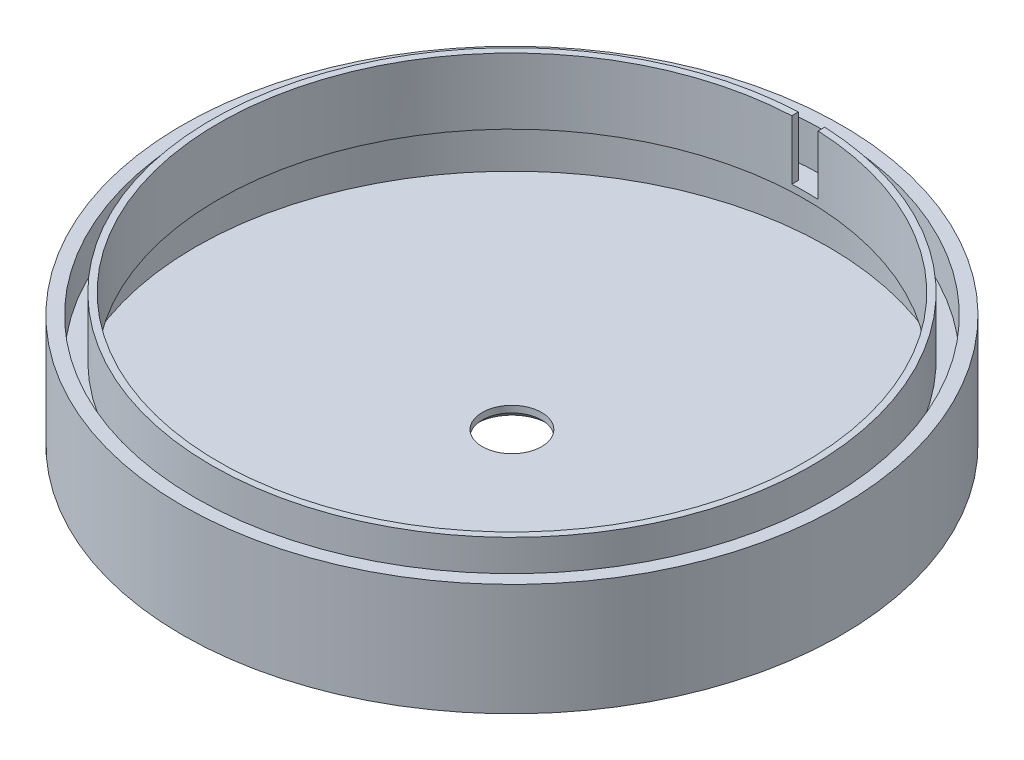
ISO-10303-21;
HEADER;
FILE_DESCRIPTION(('STEP AP214'),'2;1');
FILE_NAME('part.step','',(''),(''),'','','');
FILE_SCHEMA(('AUTOMOTIVE_DESIGN { 1 0 10303 214 1 1 1 1 }'));
ENDSEC;
DATA;
#1=APPLICATION_CONTEXT('core data for automotive mechanical design processes');
#2=APPLICATION_PROTOCOL_DEFINITION('international standard','automotive_design',2000,#1);
#3=PRODUCT_CONTEXT('',#1,'mechanical');
#4=PRODUCT('Part','Part','',(#3));
#5=PRODUCT_RELATED_PRODUCT_CATEGORY('part','',(#4));
#6=PRODUCT_DEFINITION_FORMATION('','',#4);
#7=PRODUCT_DEFINITION_CONTEXT('part definition',#1,'design');
#8=PRODUCT_DEFINITION('design','',#6,#7);
#9=PRODUCT_DEFINITION_SHAPE('','',#8);
#10=(LENGTH_UNIT() NAMED_UNIT(*) SI_UNIT(.MILLI.,.METRE.));
#11=(NAMED_UNIT(*) PLANE_ANGLE_UNIT() SI_UNIT($,.RADIAN.));
#12=(NAMED_UNIT(*) SI_UNIT($,.STERADIAN.) SOLID_ANGLE_UNIT());
#13=UNCERTAINTY_MEASURE_WITH_UNIT(LENGTH_MEASURE(1.E-05),#10,'distance_accuracy_value','');
#14=(GEOMETRIC_REPRESENTATION_CONTEXT(3) GLOBAL_UNCERTAINTY_ASSIGNED_CONTEXT((#13)) GLOBAL_UNIT_ASSIGNED_CONTEXT((#10,
#11,#12)) REPRESENTATION_CONTEXT('',''));
#15=CARTESIAN_POINT('',(0.,0.,0.));
#16=DIRECTION('',(0.,0.,1.));
#17=DIRECTION('',(1.,0.,0.));
#18=AXIS2_PLACEMENT_3D('',#15,#16,#17);
#19=CARTESIAN_POINT('',(0.,11.,0.));
#20=DIRECTION('',(0.,1.,0.));
#21=DIRECTION('',(0.,0.,1.));
#22=AXIS2_PLACEMENT_3D('',#19,#20,#21);
#23=PLANE('',#22);
#24=CARTESIAN_POINT('',(0.,11.,0.));
#25=DIRECTION('',(0.,1.,0.));
#26=DIRECTION('',(0.,0.,1.));
#27=AXIS2_PLACEMENT_3D('',#24,#25,#26);
#28=CIRCLE('',#27,45.5);
#29=CARTESIAN_POINT('',(1.99999999999999,11.,-45.4560227032678));
#30=VERTEX_POINT('',#29);
#31=CARTESIAN_POINT('',(-2.00000000000001,11.,-45.4560227032678));
#32=VERTEX_POINT('',#31);
#33=EDGE_CURVE('E90',#30,#32,#28,.F.);
#34=ORIENTED_EDGE('',*,*,#33,.T.);
#35=DIRECTION('',(0.,0.,-1.));
#36=VECTOR('',#35,1.);
#37=CARTESIAN_POINT('',(-2.00000000000001,11.,-46.5));
#38=LINE('',#37,#36);
#39=CARTESIAN_POINT('',(-2.00000000000001,11.,-44.4550334607905));
#40=VERTEX_POINT('',#39);
#41=EDGE_CURVE('E77',#40,#32,#38,.T.);
#42=ORIENTED_EDGE('',*,*,#41,.F.);
#43=CARTESIAN_POINT('',(0.,11.,0.));
#44=DIRECTION('',(0.,1.,0.));
#45=DIRECTION('',(0.,0.,1.));
#46=AXIS2_PLACEMENT_3D('',#43,#44,#45);
#47=CIRCLE('',#46,44.5);
#48=CARTESIAN_POINT('',(1.99999999999999,11.,-44.4550334607905));
#49=VERTEX_POINT('',#48);
#50=EDGE_CURVE('E88',#49,#40,#47,.T.);
#51=ORIENTED_EDGE('',*,*,#50,.F.);
#52=DIRECTION('',(0.,0.,1.));
#53=VECTOR('',#52,1.);
#54=CARTESIAN_POINT('',(1.99999999999999,11.,-46.5));
#55=LINE('',#54,#53);
#56=EDGE_CURVE('E48',#30,#49,#55,.T.);
#57=ORIENTED_EDGE('',*,*,#56,.F.);
#58=EDGE_LOOP('',(#34,#42,#51,#57));
#59=FACE_BOUND('',#58,.T.);
#60=CARTESIAN_POINT('',(0.,11.,0.));
#61=DIRECTION('',(0.,1.,0.));
#62=DIRECTION('',(0.,0.,1.));
#63=AXIS2_PLACEMENT_3D('',#60,#61,#62);
#64=CIRCLE('',#63,48.);
#65=CARTESIAN_POINT('',(0.,11.,48.));
#66=VERTEX_POINT('',#65);
#67=EDGE_CURVE('E130',#66,#66,#64,.T.);
#68=ORIENTED_EDGE('',*,*,#67,.T.);
#69=EDGE_LOOP('',(#68));
#70=FACE_BOUND('',#69,.T.);
#71=ADVANCED_FACE('F33',(#59,#70),#23,.T.);
#72=CARTESIAN_POINT('',(0.,17.,0.));
#73=DIRECTION('',(0.,-1.,0.));
#74=DIRECTION('',(0.,0.,-1.));
#75=AXIS2_PLACEMENT_3D('',#72,#73,#74);
#76=CYLINDRICAL_SURFACE('',#75,48.);
#77=CARTESIAN_POINT('',(0.,2.,0.));
#78=DIRECTION('',(0.,1.,0.));
#79=DIRECTION('',(0.,0.,1.));
#80=AXIS2_PLACEMENT_3D('',#77,#78,#79);
#81=CIRCLE('',#80,48.);
#82=CARTESIAN_POINT('',(0.,2.,48.));
#83=VERTEX_POINT('',#82);
#84=EDGE_CURVE('E109',#83,#83,#81,.T.);
#85=ORIENTED_EDGE('',*,*,#84,.F.);
#86=EDGE_LOOP('',(#85));
#87=FACE_BOUND('',#86,.T.);
#88=CARTESIAN_POINT('',(0.,10.,0.));
#89=DIRECTION('',(0.,1.,0.));
#90=DIRECTION('',(0.,0.,1.));
#91=AXIS2_PLACEMENT_3D('',#88,#89,#90);
#92=CIRCLE('',#91,48.);
#93=CARTESIAN_POINT('',(0.,10.,48.));
#94=VERTEX_POINT('',#93);
#95=EDGE_CURVE('E108',#94,#94,#92,.T.);
#96=ORIENTED_EDGE('',*,*,#95,.T.);
#97=EDGE_LOOP('',(#96));
#98=FACE_BOUND('',#97,.T.);
#99=ADVANCED_FACE('F148',(#87,#98),#76,.F.);
#100=CARTESIAN_POINT('',(0.,0.,0.));
#101=DIRECTION('',(0.,1.,0.));
#102=DIRECTION('',(0.,0.,1.));
#103=AXIS2_PLACEMENT_3D('',#100,#101,#102);
#104=PLANE('',#103);
#105=CARTESIAN_POINT('',(0.,0.,0.));
#106=DIRECTION('',(0.,1.,0.));
#107=DIRECTION('',(0.,0.,1.));
#108=AXIS2_PLACEMENT_3D('',#105,#106,#107);
#109=CIRCLE('',#108,5.50000000000001);
#110=CARTESIAN_POINT('',(0.,0.,5.50000000000001));
#111=VERTEX_POINT('',#110);
#112=EDGE_CURVE('E120',#111,#111,#109,.T.);
#113=ORIENTED_EDGE('',*,*,#112,.T.);
#114=EDGE_LOOP('',(#113));
#115=FACE_BOUND('',#114,.T.);
#116=CARTESIAN_POINT('',(0.,0.,0.));
#117=DIRECTION('',(0.,1.,0.));
#118=DIRECTION('',(0.,0.,1.));
#119=AXIS2_PLACEMENT_3D('',#116,#117,#118);
#120=CIRCLE('',#119,50.);
#121=CARTESIAN_POINT('',(0.,0.,50.));
#122=VERTEX_POINT('',#121);
#123=EDGE_CURVE('E116',#122,#122,#120,.T.);
#124=ORIENTED_EDGE('',*,*,#123,.F.);
#125=EDGE_LOOP('',(#124));
#126=FACE_BOUND('',#125,.T.);
#127=ADVANCED_FACE('F153',(#115,#126),#104,.F.);
#128=CARTESIAN_POINT('',(0.,2.,0.));
#129=DIRECTION('',(0.,1.,0.));
#130=DIRECTION('',(0.,0.,1.));
#131=AXIS2_PLACEMENT_3D('',#128,#129,#130);
#132=PLANE('',#131);
#133=ORIENTED_EDGE('',*,*,#84,.T.);
#134=EDGE_LOOP('',(#133));
#135=FACE_BOUND('',#134,.T.);
#136=CARTESIAN_POINT('',(0.,2.,0.));
#137=DIRECTION('',(0.,1.,0.));
#138=DIRECTION('',(0.,0.,1.));
#139=AXIS2_PLACEMENT_3D('',#136,#137,#138);
#140=CIRCLE('',#139,4.5);
#141=CARTESIAN_POINT('',(0.,2.,4.5));
#142=VERTEX_POINT('',#141);
#143=EDGE_CURVE('E113',#142,#142,#140,.F.);
#144=ORIENTED_EDGE('',*,*,#143,.T.);
#145=EDGE_LOOP('',(#144));
#146=FACE_BOUND('',#145,.T.);
#147=ADVANCED_FACE('F171',(#135,#146),#132,.T.);
#148=CARTESIAN_POINT('',(0.,17.,0.));
#149=DIRECTION('',(0.,-1.,0.));
#150=DIRECTION('',(0.,0.,-1.));
#151=AXIS2_PLACEMENT_3D('',#148,#149,#150);
#152=CYLINDRICAL_SURFACE('',#151,50.);
#153=CARTESIAN_POINT('',(0.,17.,0.));
#154=DIRECTION('',(0.,1.,0.));
#155=DIRECTION('',(0.,0.,1.));
#156=AXIS2_PLACEMENT_3D('',#153,#154,#155);
#157=CIRCLE('',#156,50.);
#158=CARTESIAN_POINT('',(0.,17.,50.));
#159=VERTEX_POINT('',#158);
#160=EDGE_CURVE('E117',#159,#159,#157,.T.);
#161=ORIENTED_EDGE('',*,*,#160,.F.);
#162=EDGE_LOOP('',(#161));
#163=FACE_BOUND('',#162,.T.);
#164=ORIENTED_EDGE('',*,*,#123,.T.);
#165=EDGE_LOOP('',(#164));
#166=FACE_BOUND('',#165,.T.);
#167=ADVANCED_FACE('F174',(#163,#166),#152,.T.);
#168=CARTESIAN_POINT('',(0.,17.,0.));
#169=DIRECTION('',(0.,1.,0.));
#170=DIRECTION('',(0.,0.,1.));
#171=AXIS2_PLACEMENT_3D('',#168,#169,#170);
#172=PLANE('',#171);
#173=CARTESIAN_POINT('',(0.,17.,0.));
#174=DIRECTION('',(0.,1.,0.));
#175=DIRECTION('',(0.,0.,1.));
#176=AXIS2_PLACEMENT_3D('',#173,#174,#175);
#177=CIRCLE('',#176,48.);
#178=CARTESIAN_POINT('',(0.,17.,48.));
#179=VERTEX_POINT('',#178);
#180=EDGE_CURVE('E112',#179,#179,#177,.T.);
#181=ORIENTED_EDGE('',*,*,#180,.F.);
#182=EDGE_LOOP('',(#181));
#183=FACE_BOUND('',#182,.T.);
#184=ORIENTED_EDGE('',*,*,#160,.T.);
#185=EDGE_LOOP('',(#184));
#186=FACE_BOUND('',#185,.T.);
#187=ADVANCED_FACE('F169',(#183,#186),#172,.T.);
#188=ORIENTED_EDGE('',*,*,#67,.F.);
#189=EDGE_LOOP('',(#188));
#190=FACE_BOUND('',#189,.T.);
#191=ORIENTED_EDGE('',*,*,#180,.T.);
#192=EDGE_LOOP('',(#191));
#193=FACE_BOUND('',#192,.T.);
#194=ADVANCED_FACE('F156',(#190,#193),#76,.F.);
#195=CARTESIAN_POINT('',(0.,17.,0.));
#196=DIRECTION('',(0.,-1.,0.));
#197=DIRECTION('',(0.,0.,-1.));
#198=AXIS2_PLACEMENT_3D('',#195,#196,#197);
#199=CYLINDRICAL_SURFACE('',#198,4.5);
#200=CARTESIAN_POINT('',(0.,1.00000000000002,0.));
#201=DIRECTION('',(0.,1.,0.));
#202=DIRECTION('',(0.,0.,1.));
#203=AXIS2_PLACEMENT_3D('',#200,#201,#202);
#204=CIRCLE('',#203,4.5);
#205=CARTESIAN_POINT('',(0.,1.00000000000002,4.5));
#206=VERTEX_POINT('',#205);
#207=EDGE_CURVE('E127',#206,#206,#204,.F.);
#208=ORIENTED_EDGE('',*,*,#207,.T.);
#209=EDGE_LOOP('',(#208));
#210=FACE_BOUND('',#209,.T.);
#211=ORIENTED_EDGE('',*,*,#143,.F.);
#212=EDGE_LOOP('',(#211));
#213=FACE_BOUND('',#212,.T.);
#214=ADVANCED_FACE('F164',(#210,#213),#199,.F.);
#215=CARTESIAN_POINT('',(0.,0.,0.));
#216=DIRECTION('',(0.,-1.,0.));
#217=DIRECTION('',(0.,0.,-1.));
#218=AXIS2_PLACEMENT_3D('',#215,#216,#217);
#219=CONICAL_SURFACE('',#218,5.50000000000001,0.785398163397442);
#220=ORIENTED_EDGE('',*,*,#207,.F.);
#221=EDGE_LOOP('',(#220));
#222=FACE_BOUND('',#221,.T.);
#223=ORIENTED_EDGE('',*,*,#112,.F.);
#224=EDGE_LOOP('',(#223));
#225=FACE_BOUND('',#224,.T.);
#226=ADVANCED_FACE('F35',(#222,#225),#219,.F.);
#227=CARTESIAN_POINT('',(0.,10.,0.));
#228=DIRECTION('',(0.,1.,0.));
#229=DIRECTION('',(0.,0.,1.));
#230=AXIS2_PLACEMENT_3D('',#227,#228,#229);
#231=PLANE('',#230);
#232=CARTESIAN_POINT('',(0.,10.,0.));
#233=DIRECTION('',(0.,1.,0.));
#234=DIRECTION('',(0.,0.,1.));
#235=AXIS2_PLACEMENT_3D('',#232,#233,#234);
#236=CIRCLE('',#235,44.5);
#237=CARTESIAN_POINT('',(0.,10.,44.5));
#238=VERTEX_POINT('',#237);
#239=EDGE_CURVE('E105',#238,#238,#236,.T.);
#240=ORIENTED_EDGE('',*,*,#239,.T.);
#241=EDGE_LOOP('',(#240));
#242=FACE_BOUND('',#241,.T.);
#243=ORIENTED_EDGE('',*,*,#95,.F.);
#244=EDGE_LOOP('',(#243));
#245=FACE_BOUND('',#244,.T.);
#246=ADVANCED_FACE('F160',(#242,#245),#231,.F.);
#247=CARTESIAN_POINT('',(0.,11.,0.));
#248=DIRECTION('',(0.,-1.,0.));
#249=DIRECTION('',(0.,0.,-1.));
#250=AXIS2_PLACEMENT_3D('',#247,#248,#249);
#251=CYLINDRICAL_SURFACE('',#250,44.5);
#252=DIRECTION('',(0.,-1.,0.));
#253=VECTOR('',#252,1.);
#254=CARTESIAN_POINT('',(-2.00000000000001,11.,-44.4550334607905));
#255=LINE('',#254,#253);
#256=CARTESIAN_POINT('',(-2.00000000000001,20.,-44.4550334607905));
#257=VERTEX_POINT('',#256);
#258=EDGE_CURVE('E74',#257,#40,#255,.T.);
#259=ORIENTED_EDGE('',*,*,#258,.F.);
#260=CARTESIAN_POINT('',(0.,20.,0.));
#261=DIRECTION('',(0.,1.,0.));
#262=DIRECTION('',(0.,0.,1.));
#263=AXIS2_PLACEMENT_3D('',#260,#261,#262);
#264=CIRCLE('',#263,44.5);
#265=CARTESIAN_POINT('',(1.99999999999999,20.,-44.4550334607905));
#266=VERTEX_POINT('',#265);
#267=EDGE_CURVE('E84',#257,#266,#264,.T.);
#268=ORIENTED_EDGE('',*,*,#267,.T.);
#269=DIRECTION('',(0.,-1.,0.));
#270=VECTOR('',#269,1.);
#271=CARTESIAN_POINT('',(1.99999999999999,11.,-44.4550334607905));
#272=LINE('',#271,#270);
#273=EDGE_CURVE('E85',#49,#266,#272,.F.);
#274=ORIENTED_EDGE('',*,*,#273,.F.);
#275=ORIENTED_EDGE('',*,*,#50,.T.);
#276=EDGE_LOOP('',(#259,#268,#274,#275));
#277=FACE_BOUND('',#276,.T.);
#278=ORIENTED_EDGE('',*,*,#239,.F.);
#279=EDGE_LOOP('',(#278));
#280=FACE_BOUND('',#279,.T.);
#281=ADVANCED_FACE('F93',(#277,#280),#251,.F.);
#282=CARTESIAN_POINT('',(0.,20.,0.));
#283=DIRECTION('',(0.,1.,0.));
#284=DIRECTION('',(0.,0.,1.));
#285=AXIS2_PLACEMENT_3D('',#282,#283,#284);
#286=PLANE('',#285);
#287=DIRECTION('',(0.,0.,1.));
#288=VECTOR('',#287,1.);
#289=CARTESIAN_POINT('',(-2.00000000000001,20.,-46.5));
#290=LINE('',#289,#288);
#291=CARTESIAN_POINT('',(-2.00000000000001,20.,-45.4560227032678));
#292=VERTEX_POINT('',#291);
#293=EDGE_CURVE('E79',#292,#257,#290,.T.);
#294=ORIENTED_EDGE('',*,*,#293,.F.);
#295=CARTESIAN_POINT('',(0.,20.,0.));
#296=DIRECTION('',(0.,1.,0.));
#297=DIRECTION('',(0.,0.,1.));
#298=AXIS2_PLACEMENT_3D('',#295,#296,#297);
#299=CIRCLE('',#298,45.5);
#300=CARTESIAN_POINT('',(1.99999999999999,20.,-45.4560227032678));
#301=VERTEX_POINT('',#300);
#302=EDGE_CURVE('E101',#292,#301,#299,.T.);
#303=ORIENTED_EDGE('',*,*,#302,.T.);
#304=DIRECTION('',(0.,0.,-1.));
#305=VECTOR('',#304,1.);
#306=CARTESIAN_POINT('',(1.99999999999999,20.,-46.5));
#307=LINE('',#306,#305);
#308=EDGE_CURVE('E55',#266,#301,#307,.T.);
#309=ORIENTED_EDGE('',*,*,#308,.F.);
#310=ORIENTED_EDGE('',*,*,#267,.F.);
#311=EDGE_LOOP('',(#294,#303,#309,#310));
#312=FACE_BOUND('',#311,.T.);
#313=ADVANCED_FACE('F138',(#312),#286,.T.);
#314=CARTESIAN_POINT('',(0.,20.,0.));
#315=DIRECTION('',(0.,-1.,0.));
#316=DIRECTION('',(0.,0.,-1.));
#317=AXIS2_PLACEMENT_3D('',#314,#315,#316);
#318=CYLINDRICAL_SURFACE('',#317,45.5);
#319=ORIENTED_EDGE('',*,*,#302,.F.);
#320=DIRECTION('',(0.,-1.,0.));
#321=VECTOR('',#320,1.);
#322=CARTESIAN_POINT('',(-2.00000000000001,20.,-45.4560227032678));
#323=LINE('',#322,#321);
#324=EDGE_CURVE('E11',#292,#32,#323,.T.);
#325=ORIENTED_EDGE('',*,*,#324,.T.);
#326=ORIENTED_EDGE('',*,*,#33,.F.);
#327=DIRECTION('',(0.,-1.,0.));
#328=VECTOR('',#327,1.);
#329=CARTESIAN_POINT('',(1.99999999999999,20.,-45.4560227032678));
#330=LINE('',#329,#328);
#331=EDGE_CURVE('E41',#30,#301,#330,.F.);
#332=ORIENTED_EDGE('',*,*,#331,.T.);
#333=EDGE_LOOP('',(#319,#325,#326,#332));
#334=FACE_BOUND('',#333,.T.);
#335=ADVANCED_FACE('F136',(#334),#318,.T.);
#336=CARTESIAN_POINT('',(-2.00000000000001,6.28300943397169,-46.5));
#337=DIRECTION('',(-1.,0.,0.));
#338=DIRECTION('',(0.,0.,1.));
#339=AXIS2_PLACEMENT_3D('',#336,#337,#338);
#340=PLANE('',#339);
#341=ORIENTED_EDGE('',*,*,#258,.T.);
#342=ORIENTED_EDGE('',*,*,#41,.T.);
#343=ORIENTED_EDGE('',*,*,#324,.F.);
#344=ORIENTED_EDGE('',*,*,#293,.T.);
#345=EDGE_LOOP('',(#341,#342,#343,#344));
#346=FACE_BOUND('',#345,.T.);
#347=ADVANCED_FACE('F76',(#346),#340,.F.);
#348=CARTESIAN_POINT('',(1.99999999999999,6.28300943397169,-46.5));
#349=DIRECTION('',(1.,0.,0.));
#350=DIRECTION('',(0.,0.,-1.));
#351=AXIS2_PLACEMENT_3D('',#348,#349,#350);
#352=PLANE('',#351);
#353=ORIENTED_EDGE('',*,*,#273,.T.);
#354=ORIENTED_EDGE('',*,*,#308,.T.);
#355=ORIENTED_EDGE('',*,*,#331,.F.);
#356=ORIENTED_EDGE('',*,*,#56,.T.);
#357=EDGE_LOOP('',(#353,#354,#355,#356));
#358=FACE_BOUND('',#357,.T.);
#359=ADVANCED_FACE('F140',(#358),#352,.F.);
#360=CLOSED_SHELL('',(#71,#99,#127,#147,#167,#187,#194,#214,#226,#246,#281,#313,#335,#347,#359));
#361=MANIFOLD_SOLID_BREP('B2',#360);
#362=ADVANCED_BREP_SHAPE_REPRESENTATION('',(#18,#361),#14);
#363=SHAPE_DEFINITION_REPRESENTATION(#9,#362);
ENDSEC;
END-ISO-10303-21;
